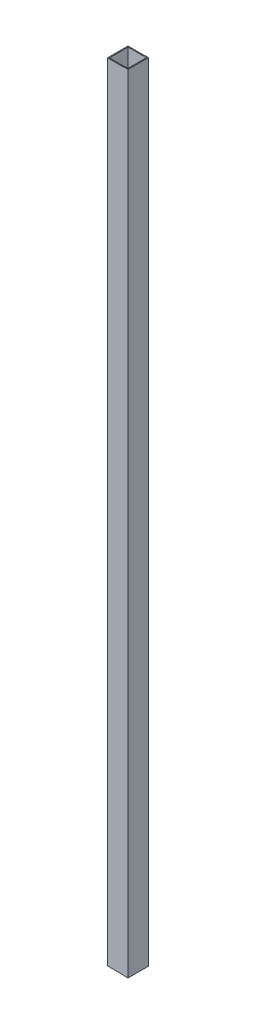
ISO-10303-21;
HEADER;
FILE_DESCRIPTION(('STEP AP214'),'2;1');
FILE_NAME('part.step','',(''),(''),'','','');
FILE_SCHEMA(('AUTOMOTIVE_DESIGN { 1 0 10303 214 1 1 1 1 }'));
ENDSEC;
DATA;
#1=APPLICATION_CONTEXT('core data for automotive mechanical design processes');
#2=APPLICATION_PROTOCOL_DEFINITION('international standard','automotive_design',2000,#1);
#3=PRODUCT_CONTEXT('',#1,'mechanical');
#4=PRODUCT('Part','Part','',(#3));
#5=PRODUCT_RELATED_PRODUCT_CATEGORY('part','',(#4));
#6=PRODUCT_DEFINITION_FORMATION('','',#4);
#7=PRODUCT_DEFINITION_CONTEXT('part definition',#1,'design');
#8=PRODUCT_DEFINITION('design','',#6,#7);
#9=PRODUCT_DEFINITION_SHAPE('','',#8);
#10=(LENGTH_UNIT() NAMED_UNIT(*) SI_UNIT(.MILLI.,.METRE.));
#11=(NAMED_UNIT(*) PLANE_ANGLE_UNIT() SI_UNIT($,.RADIAN.));
#12=(NAMED_UNIT(*) SI_UNIT($,.STERADIAN.) SOLID_ANGLE_UNIT());
#13=UNCERTAINTY_MEASURE_WITH_UNIT(LENGTH_MEASURE(1.E-05),#10,'distance_accuracy_value','');
#14=(GEOMETRIC_REPRESENTATION_CONTEXT(3) GLOBAL_UNCERTAINTY_ASSIGNED_CONTEXT((#13)) GLOBAL_UNIT_ASSIGNED_CONTEXT((#10,
#11,#12)) REPRESENTATION_CONTEXT('',''));
#15=CARTESIAN_POINT('',(0.,0.,0.));
#16=DIRECTION('',(0.,0.,1.));
#17=DIRECTION('',(1.,0.,0.));
#18=AXIS2_PLACEMENT_3D('',#15,#16,#17);
#19=CARTESIAN_POINT('',(0.,1923.,0.));
#20=DIRECTION('',(0.,-1.,0.));
#21=DIRECTION('',(0.,0.,-1.));
#22=AXIS2_PLACEMENT_3D('',#19,#20,#21);
#23=PLANE('',#22);
#24=DIRECTION('',(-1.,0.,0.));
#25=VECTOR('',#24,1.);
#26=CARTESIAN_POINT('',(0.,1923.,-50.));
#27=LINE('',#26,#25);
#28=CARTESIAN_POINT('',(50.,1923.,-50.));
#29=VERTEX_POINT('',#28);
#30=CARTESIAN_POINT('',(40.,1923.,-50.));
#31=VERTEX_POINT('',#30);
#32=EDGE_CURVE('E184',#29,#31,#27,.T.);
#33=ORIENTED_EDGE('',*,*,#32,.T.);
#34=DIRECTION('',(0.,0.,1.));
#35=VECTOR('',#34,1.);
#36=CARTESIAN_POINT('',(40.,1923.,-50.));
#37=LINE('',#36,#35);
#38=CARTESIAN_POINT('',(40.,1923.,-47.8));
#39=VERTEX_POINT('',#38);
#40=EDGE_CURVE('E257',#31,#39,#37,.T.);
#41=ORIENTED_EDGE('',*,*,#40,.T.);
#42=DIRECTION('',(-1.,0.,0.));
#43=VECTOR('',#42,1.);
#44=CARTESIAN_POINT('',(2.2,1923.,-47.8));
#45=LINE('',#44,#43);
#46=CARTESIAN_POINT('',(47.8,1923.,-47.8));
#47=VERTEX_POINT('',#46);
#48=EDGE_CURVE('E208',#47,#39,#45,.T.);
#49=ORIENTED_EDGE('',*,*,#48,.F.);
#50=DIRECTION('',(0.,0.,-1.));
#51=VECTOR('',#50,1.);
#52=CARTESIAN_POINT('',(47.8,1923.,-47.8));
#53=LINE('',#52,#51);
#54=CARTESIAN_POINT('',(47.8,1923.,-2.2));
#55=VERTEX_POINT('',#54);
#56=EDGE_CURVE('E213',#55,#47,#53,.T.);
#57=ORIENTED_EDGE('',*,*,#56,.F.);
#58=DIRECTION('',(1.,0.,0.));
#59=VECTOR('',#58,1.);
#60=CARTESIAN_POINT('',(47.8,1923.,-2.2));
#61=LINE('',#60,#59);
#62=CARTESIAN_POINT('',(40.,1923.,-2.2));
#63=VERTEX_POINT('',#62);
#64=EDGE_CURVE('E277',#63,#55,#61,.T.);
#65=ORIENTED_EDGE('',*,*,#64,.F.);
#66=CARTESIAN_POINT('',(40.,1923.,0.));
#67=VERTEX_POINT('',#66);
#68=EDGE_CURVE('E241',#63,#67,#37,.T.);
#69=ORIENTED_EDGE('',*,*,#68,.T.);
#70=DIRECTION('',(1.,0.,0.));
#71=VECTOR('',#70,1.);
#72=CARTESIAN_POINT('',(50.,1923.,0.));
#73=LINE('',#72,#71);
#74=CARTESIAN_POINT('',(50.,1923.,0.));
#75=VERTEX_POINT('',#74);
#76=EDGE_CURVE('E171',#67,#75,#73,.T.);
#77=ORIENTED_EDGE('',*,*,#76,.T.);
#78=DIRECTION('',(0.,0.,-1.));
#79=VECTOR('',#78,1.);
#80=CARTESIAN_POINT('',(50.,1923.,-50.));
#81=LINE('',#80,#79);
#82=EDGE_CURVE('E174',#75,#29,#81,.T.);
#83=ORIENTED_EDGE('',*,*,#82,.T.);
#84=EDGE_LOOP('',(#33,#41,#49,#57,#65,#69,#77,#83));
#85=FACE_BOUND('',#84,.T.);
#86=ADVANCED_FACE('F33',(#85),#23,.F.);
#87=CARTESIAN_POINT('',(0.,0.,0.));
#88=DIRECTION('',(0.,-1.,0.));
#89=DIRECTION('',(0.,0.,-1.));
#90=AXIS2_PLACEMENT_3D('',#87,#88,#89);
#91=PLANE('',#90);
#92=DIRECTION('',(0.,0.,1.));
#93=VECTOR('',#92,1.);
#94=CARTESIAN_POINT('',(40.,0.,-50.));
#95=LINE('',#94,#93);
#96=CARTESIAN_POINT('',(40.,0.,-50.));
#97=VERTEX_POINT('',#96);
#98=CARTESIAN_POINT('',(40.,0.,-47.8));
#99=VERTEX_POINT('',#98);
#100=EDGE_CURVE('E56',#97,#99,#95,.T.);
#101=ORIENTED_EDGE('',*,*,#100,.F.);
#102=DIRECTION('',(-1.,0.,0.));
#103=VECTOR('',#102,1.);
#104=CARTESIAN_POINT('',(0.,0.,-50.));
#105=LINE('',#104,#103);
#106=CARTESIAN_POINT('',(50.,0.,-50.));
#107=VERTEX_POINT('',#106);
#108=EDGE_CURVE('E159',#107,#97,#105,.T.);
#109=ORIENTED_EDGE('',*,*,#108,.F.);
#110=DIRECTION('',(0.,0.,-1.));
#111=VECTOR('',#110,1.);
#112=CARTESIAN_POINT('',(50.,0.,-50.));
#113=LINE('',#112,#111);
#114=CARTESIAN_POINT('',(50.,0.,0.));
#115=VERTEX_POINT('',#114);
#116=EDGE_CURVE('E172',#115,#107,#113,.T.);
#117=ORIENTED_EDGE('',*,*,#116,.F.);
#118=DIRECTION('',(1.,0.,0.));
#119=VECTOR('',#118,1.);
#120=CARTESIAN_POINT('',(50.,0.,0.));
#121=LINE('',#120,#119);
#122=CARTESIAN_POINT('',(40.,0.,0.));
#123=VERTEX_POINT('',#122);
#124=EDGE_CURVE('E176',#123,#115,#121,.T.);
#125=ORIENTED_EDGE('',*,*,#124,.F.);
#126=CARTESIAN_POINT('',(40.,0.,-2.2));
#127=VERTEX_POINT('',#126);
#128=EDGE_CURVE('E164',#127,#123,#95,.T.);
#129=ORIENTED_EDGE('',*,*,#128,.F.);
#130=DIRECTION('',(1.,0.,0.));
#131=VECTOR('',#130,1.);
#132=CARTESIAN_POINT('',(47.8,0.,-2.2));
#133=LINE('',#132,#131);
#134=CARTESIAN_POINT('',(47.8,0.,-2.2));
#135=VERTEX_POINT('',#134);
#136=EDGE_CURVE('E276',#127,#135,#133,.T.);
#137=ORIENTED_EDGE('',*,*,#136,.T.);
#138=DIRECTION('',(0.,0.,-1.));
#139=VECTOR('',#138,1.);
#140=CARTESIAN_POINT('',(47.8,0.,-47.8));
#141=LINE('',#140,#139);
#142=CARTESIAN_POINT('',(47.8,0.,-47.8));
#143=VERTEX_POINT('',#142);
#144=EDGE_CURVE('E281',#135,#143,#141,.T.);
#145=ORIENTED_EDGE('',*,*,#144,.T.);
#146=DIRECTION('',(-1.,0.,0.));
#147=VECTOR('',#146,1.);
#148=CARTESIAN_POINT('',(2.2,0.,-47.8));
#149=LINE('',#148,#147);
#150=EDGE_CURVE('E162',#143,#99,#149,.T.);
#151=ORIENTED_EDGE('',*,*,#150,.T.);
#152=EDGE_LOOP('',(#101,#109,#117,#125,#129,#137,#145,#151));
#153=FACE_BOUND('',#152,.T.);
#154=ADVANCED_FACE('F157',(#153),#91,.T.);
#155=CARTESIAN_POINT('',(50.,1923.,0.));
#156=DIRECTION('',(0.,0.,-1.));
#157=DIRECTION('',(-1.,0.,0.));
#158=AXIS2_PLACEMENT_3D('',#155,#156,#157);
#159=PLANE('',#158);
#160=DIRECTION('',(0.,-1.,0.));
#161=VECTOR('',#160,1.);
#162=CARTESIAN_POINT('',(0.,1923.,0.));
#163=LINE('',#162,#161);
#164=CARTESIAN_POINT('',(0.,1922.5,0.));
#165=VERTEX_POINT('',#164);
#166=CARTESIAN_POINT('',(0.,0.5,0.));
#167=VERTEX_POINT('',#166);
#168=EDGE_CURVE('E180',#165,#167,#163,.T.);
#169=ORIENTED_EDGE('',*,*,#168,.T.);
#170=DIRECTION('',(-1.,0.,0.));
#171=VECTOR('',#170,1.);
#172=CARTESIAN_POINT('',(0.,0.5,0.));
#173=LINE('',#172,#171);
#174=CARTESIAN_POINT('',(40.,0.5,0.));
#175=VERTEX_POINT('',#174);
#176=EDGE_CURVE('E152',#175,#167,#173,.T.);
#177=ORIENTED_EDGE('',*,*,#176,.F.);
#178=DIRECTION('',(0.,1.,0.));
#179=VECTOR('',#178,1.);
#180=CARTESIAN_POINT('',(40.,0.5,0.));
#181=LINE('',#180,#179);
#182=EDGE_CURVE('E232',#123,#175,#181,.T.);
#183=ORIENTED_EDGE('',*,*,#182,.F.);
#184=ORIENTED_EDGE('',*,*,#124,.T.);
#185=DIRECTION('',(0.,-1.,0.));
#186=VECTOR('',#185,1.);
#187=CARTESIAN_POINT('',(50.,1923.,0.));
#188=LINE('',#187,#186);
#189=EDGE_CURVE('E188',#75,#115,#188,.T.);
#190=ORIENTED_EDGE('',*,*,#189,.F.);
#191=ORIENTED_EDGE('',*,*,#76,.F.);
#192=DIRECTION('',(0.,1.,0.));
#193=VECTOR('',#192,1.);
#194=CARTESIAN_POINT('',(40.,1923.,0.));
#195=LINE('',#194,#193);
#196=CARTESIAN_POINT('',(40.,1922.5,0.));
#197=VERTEX_POINT('',#196);
#198=EDGE_CURVE('E244',#197,#67,#195,.T.);
#199=ORIENTED_EDGE('',*,*,#198,.F.);
#200=DIRECTION('',(1.,0.,0.));
#201=VECTOR('',#200,1.);
#202=CARTESIAN_POINT('',(40.,1922.5,0.));
#203=LINE('',#202,#201);
#204=EDGE_CURVE('E246',#165,#197,#203,.T.);
#205=ORIENTED_EDGE('',*,*,#204,.F.);
#206=EDGE_LOOP('',(#169,#177,#183,#184,#190,#191,#199,#205));
#207=FACE_BOUND('',#206,.T.);
#208=ADVANCED_FACE('F35',(#207),#159,.F.);
#209=CARTESIAN_POINT('',(50.,1923.,-50.));
#210=DIRECTION('',(-1.,0.,0.));
#211=DIRECTION('',(0.,0.,1.));
#212=AXIS2_PLACEMENT_3D('',#209,#210,#211);
#213=PLANE('',#212);
#214=ORIENTED_EDGE('',*,*,#116,.T.);
#215=DIRECTION('',(0.,-1.,0.));
#216=VECTOR('',#215,1.);
#217=CARTESIAN_POINT('',(50.,1923.,-50.));
#218=LINE('',#217,#216);
#219=EDGE_CURVE('E170',#29,#107,#218,.T.);
#220=ORIENTED_EDGE('',*,*,#219,.F.);
#221=ORIENTED_EDGE('',*,*,#82,.F.);
#222=ORIENTED_EDGE('',*,*,#189,.T.);
#223=EDGE_LOOP('',(#214,#220,#221,#222));
#224=FACE_BOUND('',#223,.T.);
#225=ADVANCED_FACE('F236',(#224),#213,.F.);
#226=CARTESIAN_POINT('',(0.,1923.,-50.));
#227=DIRECTION('',(0.,0.,1.));
#228=DIRECTION('',(1.,0.,0.));
#229=AXIS2_PLACEMENT_3D('',#226,#227,#228);
#230=PLANE('',#229);
#231=DIRECTION('',(0.,1.,0.));
#232=VECTOR('',#231,1.);
#233=CARTESIAN_POINT('',(40.,0.5,-50.));
#234=LINE('',#233,#232);
#235=CARTESIAN_POINT('',(40.,0.5,-50.));
#236=VERTEX_POINT('',#235);
#237=EDGE_CURVE('E143',#97,#236,#234,.T.);
#238=ORIENTED_EDGE('',*,*,#237,.T.);
#239=DIRECTION('',(-1.,0.,0.));
#240=VECTOR('',#239,1.);
#241=CARTESIAN_POINT('',(0.,0.5,-50.));
#242=LINE('',#241,#240);
#243=CARTESIAN_POINT('',(0.,0.5,-50.));
#244=VERTEX_POINT('',#243);
#245=EDGE_CURVE('E151',#236,#244,#242,.T.);
#246=ORIENTED_EDGE('',*,*,#245,.T.);
#247=DIRECTION('',(0.,-1.,0.));
#248=VECTOR('',#247,1.);
#249=CARTESIAN_POINT('',(0.,1923.,-50.));
#250=LINE('',#249,#248);
#251=CARTESIAN_POINT('',(0.,1922.5,-50.));
#252=VERTEX_POINT('',#251);
#253=EDGE_CURVE('E183',#252,#244,#250,.T.);
#254=ORIENTED_EDGE('',*,*,#253,.F.);
#255=DIRECTION('',(1.,0.,0.));
#256=VECTOR('',#255,1.);
#257=CARTESIAN_POINT('',(40.,1922.5,-50.));
#258=LINE('',#257,#256);
#259=CARTESIAN_POINT('',(40.,1922.5,-50.));
#260=VERTEX_POINT('',#259);
#261=EDGE_CURVE('E249',#252,#260,#258,.T.);
#262=ORIENTED_EDGE('',*,*,#261,.T.);
#263=DIRECTION('',(0.,1.,0.));
#264=VECTOR('',#263,1.);
#265=CARTESIAN_POINT('',(40.,1923.,-50.));
#266=LINE('',#265,#264);
#267=EDGE_CURVE('E252',#260,#31,#266,.T.);
#268=ORIENTED_EDGE('',*,*,#267,.T.);
#269=ORIENTED_EDGE('',*,*,#32,.F.);
#270=ORIENTED_EDGE('',*,*,#219,.T.);
#271=ORIENTED_EDGE('',*,*,#108,.T.);
#272=EDGE_LOOP('',(#238,#246,#254,#262,#268,#269,#270,#271));
#273=FACE_BOUND('',#272,.T.);
#274=ADVANCED_FACE('F167',(#273),#230,.F.);
#275=CARTESIAN_POINT('',(0.,1923.,0.));
#276=DIRECTION('',(1.,0.,0.));
#277=DIRECTION('',(0.,0.,-1.));
#278=AXIS2_PLACEMENT_3D('',#275,#276,#277);
#279=PLANE('',#278);
#280=ORIENTED_EDGE('',*,*,#253,.T.);
#281=DIRECTION('',(0.,0.,1.));
#282=VECTOR('',#281,1.);
#283=CARTESIAN_POINT('',(0.,0.5,-50.));
#284=LINE('',#283,#282);
#285=EDGE_CURVE('E199',#244,#167,#284,.T.);
#286=ORIENTED_EDGE('',*,*,#285,.T.);
#287=ORIENTED_EDGE('',*,*,#168,.F.);
#288=DIRECTION('',(0.,0.,1.));
#289=VECTOR('',#288,1.);
#290=CARTESIAN_POINT('',(0.,1922.5,-50.));
#291=LINE('',#290,#289);
#292=EDGE_CURVE('E263',#252,#165,#291,.T.);
#293=ORIENTED_EDGE('',*,*,#292,.F.);
#294=EDGE_LOOP('',(#280,#286,#287,#293));
#295=FACE_BOUND('',#294,.T.);
#296=ADVANCED_FACE('F314',(#295),#279,.F.);
#297=CARTESIAN_POINT('',(2.2,1923.,-2.2));
#298=DIRECTION('',(1.,0.,0.));
#299=DIRECTION('',(0.,0.,-1.));
#300=AXIS2_PLACEMENT_3D('',#297,#298,#299);
#301=PLANE('',#300);
#302=DIRECTION('',(0.,0.,1.));
#303=VECTOR('',#302,1.);
#304=CARTESIAN_POINT('',(2.2,0.499999999999945,-2.2));
#305=LINE('',#304,#303);
#306=CARTESIAN_POINT('',(2.2,0.499999999999945,-47.8));
#307=VERTEX_POINT('',#306);
#308=CARTESIAN_POINT('',(2.2,0.499999999999945,-2.2));
#309=VERTEX_POINT('',#308);
#310=EDGE_CURVE('E272',#307,#309,#305,.T.);
#311=ORIENTED_EDGE('',*,*,#310,.F.);
#312=DIRECTION('',(0.,-1.,0.));
#313=VECTOR('',#312,1.);
#314=CARTESIAN_POINT('',(2.2,1923.,-47.8));
#315=LINE('',#314,#313);
#316=CARTESIAN_POINT('',(2.2,1922.5,-47.8));
#317=VERTEX_POINT('',#316);
#318=EDGE_CURVE('E204',#317,#307,#315,.T.);
#319=ORIENTED_EDGE('',*,*,#318,.F.);
#320=DIRECTION('',(0.,0.,-1.));
#321=VECTOR('',#320,1.);
#322=CARTESIAN_POINT('',(2.2,1922.5,-2.2));
#323=LINE('',#322,#321);
#324=CARTESIAN_POINT('',(2.2,1922.5,-2.2));
#325=VERTEX_POINT('',#324);
#326=EDGE_CURVE('E48',#325,#317,#323,.T.);
#327=ORIENTED_EDGE('',*,*,#326,.F.);
#328=DIRECTION('',(0.,-1.,0.));
#329=VECTOR('',#328,1.);
#330=CARTESIAN_POINT('',(2.2,1923.,-2.2));
#331=LINE('',#330,#329);
#332=EDGE_CURVE('E220',#325,#309,#331,.T.);
#333=ORIENTED_EDGE('',*,*,#332,.T.);
#334=EDGE_LOOP('',(#311,#319,#327,#333));
#335=FACE_BOUND('',#334,.T.);
#336=ADVANCED_FACE('F315',(#335),#301,.T.);
#337=CARTESIAN_POINT('',(47.8,1923.,-2.2));
#338=DIRECTION('',(0.,0.,-1.));
#339=DIRECTION('',(-1.,0.,0.));
#340=AXIS2_PLACEMENT_3D('',#337,#338,#339);
#341=PLANE('',#340);
#342=DIRECTION('',(1.,0.,0.));
#343=VECTOR('',#342,1.);
#344=CARTESIAN_POINT('',(47.8,0.499999999999945,-2.2));
#345=LINE('',#344,#343);
#346=CARTESIAN_POINT('',(40.,0.5,-2.2));
#347=VERTEX_POINT('',#346);
#348=EDGE_CURVE('E274',#309,#347,#345,.T.);
#349=ORIENTED_EDGE('',*,*,#348,.F.);
#350=ORIENTED_EDGE('',*,*,#332,.F.);
#351=DIRECTION('',(-1.,0.,0.));
#352=VECTOR('',#351,1.);
#353=CARTESIAN_POINT('',(47.8,1922.5,-2.2));
#354=LINE('',#353,#352);
#355=CARTESIAN_POINT('',(40.,1922.5,-2.2));
#356=VERTEX_POINT('',#355);
#357=EDGE_CURVE('E266',#356,#325,#354,.T.);
#358=ORIENTED_EDGE('',*,*,#357,.F.);
#359=DIRECTION('',(0.,-1.,0.));
#360=VECTOR('',#359,1.);
#361=CARTESIAN_POINT('',(40.,1923.,-2.2));
#362=LINE('',#361,#360);
#363=EDGE_CURVE('E268',#63,#356,#362,.T.);
#364=ORIENTED_EDGE('',*,*,#363,.F.);
#365=ORIENTED_EDGE('',*,*,#64,.T.);
#366=DIRECTION('',(0.,-1.,0.));
#367=VECTOR('',#366,1.);
#368=CARTESIAN_POINT('',(47.8,1923.,-2.2));
#369=LINE('',#368,#367);
#370=EDGE_CURVE('E210',#55,#135,#369,.T.);
#371=ORIENTED_EDGE('',*,*,#370,.T.);
#372=ORIENTED_EDGE('',*,*,#136,.F.);
#373=DIRECTION('',(0.,-1.,0.));
#374=VECTOR('',#373,1.);
#375=CARTESIAN_POINT('',(39.9999999999466,1923.,-2.2));
#376=LINE('',#375,#374);
#377=EDGE_CURVE('E270',#347,#127,#376,.T.);
#378=ORIENTED_EDGE('',*,*,#377,.F.);
#379=EDGE_LOOP('',(#349,#350,#358,#364,#365,#371,#372,#378));
#380=FACE_BOUND('',#379,.T.);
#381=ADVANCED_FACE('F305',(#380),#341,.T.);
#382=CARTESIAN_POINT('',(47.8,1923.,-47.8));
#383=DIRECTION('',(-1.,0.,0.));
#384=DIRECTION('',(0.,0.,1.));
#385=AXIS2_PLACEMENT_3D('',#382,#383,#384);
#386=PLANE('',#385);
#387=ORIENTED_EDGE('',*,*,#144,.F.);
#388=ORIENTED_EDGE('',*,*,#370,.F.);
#389=ORIENTED_EDGE('',*,*,#56,.T.);
#390=DIRECTION('',(0.,-1.,0.));
#391=VECTOR('',#390,1.);
#392=CARTESIAN_POINT('',(47.8,1923.,-47.8));
#393=LINE('',#392,#391);
#394=EDGE_CURVE('E207',#47,#143,#393,.T.);
#395=ORIENTED_EDGE('',*,*,#394,.T.);
#396=EDGE_LOOP('',(#387,#388,#389,#395));
#397=FACE_BOUND('',#396,.T.);
#398=ADVANCED_FACE('F286',(#397),#386,.T.);
#399=CARTESIAN_POINT('',(2.2,1923.,-47.8));
#400=DIRECTION('',(0.,0.,1.));
#401=DIRECTION('',(1.,0.,0.));
#402=AXIS2_PLACEMENT_3D('',#399,#400,#401);
#403=PLANE('',#402);
#404=DIRECTION('',(-1.,0.,0.));
#405=VECTOR('',#404,1.);
#406=CARTESIAN_POINT('',(2.2,0.499999999999945,-47.8));
#407=LINE('',#406,#405);
#408=CARTESIAN_POINT('',(40.,0.5,-47.8));
#409=VERTEX_POINT('',#408);
#410=EDGE_CURVE('E11',#409,#307,#407,.T.);
#411=ORIENTED_EDGE('',*,*,#410,.F.);
#412=DIRECTION('',(0.,1.,0.));
#413=VECTOR('',#412,1.);
#414=CARTESIAN_POINT('',(39.9999999999466,1923.,-47.8));
#415=LINE('',#414,#413);
#416=EDGE_CURVE('E41',#99,#409,#415,.T.);
#417=ORIENTED_EDGE('',*,*,#416,.F.);
#418=ORIENTED_EDGE('',*,*,#150,.F.);
#419=ORIENTED_EDGE('',*,*,#394,.F.);
#420=ORIENTED_EDGE('',*,*,#48,.T.);
#421=DIRECTION('',(0.,1.,0.));
#422=VECTOR('',#421,1.);
#423=CARTESIAN_POINT('',(40.,1923.,-47.8));
#424=LINE('',#423,#422);
#425=CARTESIAN_POINT('',(40.,1922.5,-47.8));
#426=VERTEX_POINT('',#425);
#427=EDGE_CURVE('E193',#426,#39,#424,.T.);
#428=ORIENTED_EDGE('',*,*,#427,.F.);
#429=DIRECTION('',(1.,0.,0.));
#430=VECTOR('',#429,1.);
#431=CARTESIAN_POINT('',(2.2,1922.5,-47.8));
#432=LINE('',#431,#430);
#433=EDGE_CURVE('E191',#317,#426,#432,.T.);
#434=ORIENTED_EDGE('',*,*,#433,.F.);
#435=ORIENTED_EDGE('',*,*,#318,.T.);
#436=EDGE_LOOP('',(#411,#417,#418,#419,#420,#428,#434,#435));
#437=FACE_BOUND('',#436,.T.);
#438=ADVANCED_FACE('F202',(#437),#403,.T.);
#439=CARTESIAN_POINT('',(40.,1923.,-50.));
#440=DIRECTION('',(1.,0.,0.));
#441=DIRECTION('',(0.,0.,-1.));
#442=AXIS2_PLACEMENT_3D('',#439,#440,#441);
#443=PLANE('',#442);
#444=ORIENTED_EDGE('',*,*,#363,.T.);
#445=DIRECTION('',(0.,0.,1.));
#446=VECTOR('',#445,1.);
#447=CARTESIAN_POINT('',(40.,1922.5,-50.));
#448=LINE('',#447,#446);
#449=EDGE_CURVE('E262',#356,#197,#448,.T.);
#450=ORIENTED_EDGE('',*,*,#449,.T.);
#451=ORIENTED_EDGE('',*,*,#198,.T.);
#452=ORIENTED_EDGE('',*,*,#68,.F.);
#453=EDGE_LOOP('',(#444,#450,#451,#452));
#454=FACE_BOUND('',#453,.T.);
#455=ADVANCED_FACE('F310',(#454),#443,.F.);
#456=ORIENTED_EDGE('',*,*,#427,.T.);
#457=ORIENTED_EDGE('',*,*,#40,.F.);
#458=ORIENTED_EDGE('',*,*,#267,.F.);
#459=EDGE_CURVE('E259',#260,#426,#448,.T.);
#460=ORIENTED_EDGE('',*,*,#459,.T.);
#461=EDGE_LOOP('',(#456,#457,#458,#460));
#462=FACE_BOUND('',#461,.T.);
#463=ADVANCED_FACE('F292',(#462),#443,.F.);
#464=CARTESIAN_POINT('',(40.,1922.5,-50.));
#465=DIRECTION('',(0.,-1.,0.));
#466=DIRECTION('',(0.,0.,-1.));
#467=AXIS2_PLACEMENT_3D('',#464,#465,#466);
#468=PLANE('',#467);
#469=ORIENTED_EDGE('',*,*,#357,.T.);
#470=ORIENTED_EDGE('',*,*,#326,.T.);
#471=ORIENTED_EDGE('',*,*,#433,.T.);
#472=ORIENTED_EDGE('',*,*,#459,.F.);
#473=ORIENTED_EDGE('',*,*,#261,.F.);
#474=ORIENTED_EDGE('',*,*,#292,.T.);
#475=ORIENTED_EDGE('',*,*,#204,.T.);
#476=ORIENTED_EDGE('',*,*,#449,.F.);
#477=EDGE_LOOP('',(#469,#470,#471,#472,#473,#474,#475,#476));
#478=FACE_BOUND('',#477,.T.);
#479=ADVANCED_FACE('F311',(#478),#468,.F.);
#480=CARTESIAN_POINT('',(40.,0.5,-50.));
#481=DIRECTION('',(1.,0.,0.));
#482=DIRECTION('',(0.,1.,0.));
#483=AXIS2_PLACEMENT_3D('',#480,#481,#482);
#484=PLANE('',#483);
#485=ORIENTED_EDGE('',*,*,#377,.T.);
#486=ORIENTED_EDGE('',*,*,#128,.T.);
#487=ORIENTED_EDGE('',*,*,#182,.T.);
#488=DIRECTION('',(0.,0.,1.));
#489=VECTOR('',#488,1.);
#490=CARTESIAN_POINT('',(40.,0.5,-50.));
#491=LINE('',#490,#489);
#492=EDGE_CURVE('E163',#347,#175,#491,.T.);
#493=ORIENTED_EDGE('',*,*,#492,.F.);
#494=EDGE_LOOP('',(#485,#486,#487,#493));
#495=FACE_BOUND('',#494,.T.);
#496=ADVANCED_FACE('F300',(#495),#484,.F.);
#497=CARTESIAN_POINT('',(0.,0.5,-50.));
#498=DIRECTION('',(0.,1.,0.));
#499=DIRECTION('',(0.,0.,1.));
#500=AXIS2_PLACEMENT_3D('',#497,#498,#499);
#501=PLANE('',#500);
#502=ORIENTED_EDGE('',*,*,#348,.T.);
#503=ORIENTED_EDGE('',*,*,#492,.T.);
#504=ORIENTED_EDGE('',*,*,#176,.T.);
#505=ORIENTED_EDGE('',*,*,#285,.F.);
#506=ORIENTED_EDGE('',*,*,#245,.F.);
#507=EDGE_CURVE('E146',#236,#409,#491,.T.);
#508=ORIENTED_EDGE('',*,*,#507,.T.);
#509=ORIENTED_EDGE('',*,*,#410,.T.);
#510=ORIENTED_EDGE('',*,*,#310,.T.);
#511=EDGE_LOOP('',(#502,#503,#504,#505,#506,#508,#509,#510));
#512=FACE_BOUND('',#511,.T.);
#513=ADVANCED_FACE('F197',(#512),#501,.F.);
#514=ORIENTED_EDGE('',*,*,#416,.T.);
#515=ORIENTED_EDGE('',*,*,#507,.F.);
#516=ORIENTED_EDGE('',*,*,#237,.F.);
#517=ORIENTED_EDGE('',*,*,#100,.T.);
#518=EDGE_LOOP('',(#514,#515,#516,#517));
#519=FACE_BOUND('',#518,.T.);
#520=ADVANCED_FACE('F144',(#519),#484,.F.);
#521=CLOSED_SHELL('',(#86,#154,#208,#225,#274,#296,#336,#381,#398,#438,#455,#463,#479,#496,#513,#520));
#522=MANIFOLD_SOLID_BREP('B2',#521);
#523=ADVANCED_BREP_SHAPE_REPRESENTATION('',(#18,#522),#14);
#524=SHAPE_DEFINITION_REPRESENTATION(#9,#523);
ENDSEC;
END-ISO-10303-21;
